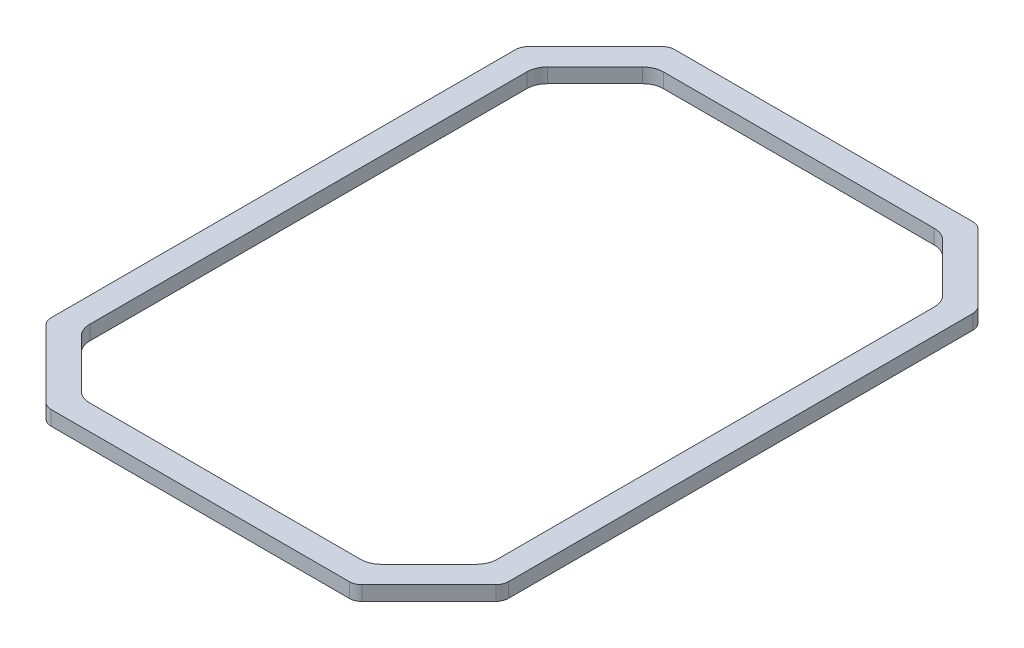
ISO-10303-21;
HEADER;
FILE_DESCRIPTION(('STEP AP214'),'2;1');
FILE_NAME('part.step','',(''),(''),'','','');
FILE_SCHEMA(('AUTOMOTIVE_DESIGN { 1 0 10303 214 1 1 1 1 }'));
ENDSEC;
DATA;
#1=APPLICATION_CONTEXT('core data for automotive mechanical design processes');
#2=APPLICATION_PROTOCOL_DEFINITION('international standard','automotive_design',2000,#1);
#3=PRODUCT_CONTEXT('',#1,'mechanical');
#4=PRODUCT('Part','Part','',(#3));
#5=PRODUCT_RELATED_PRODUCT_CATEGORY('part','',(#4));
#6=PRODUCT_DEFINITION_FORMATION('','',#4);
#7=PRODUCT_DEFINITION_CONTEXT('part definition',#1,'design');
#8=PRODUCT_DEFINITION('design','',#6,#7);
#9=PRODUCT_DEFINITION_SHAPE('','',#8);
#10=(LENGTH_UNIT() NAMED_UNIT(*) SI_UNIT(.MILLI.,.METRE.));
#11=(NAMED_UNIT(*) PLANE_ANGLE_UNIT() SI_UNIT($,.RADIAN.));
#12=(NAMED_UNIT(*) SI_UNIT($,.STERADIAN.) SOLID_ANGLE_UNIT());
#13=UNCERTAINTY_MEASURE_WITH_UNIT(LENGTH_MEASURE(1.E-05),#10,'distance_accuracy_value','');
#14=(GEOMETRIC_REPRESENTATION_CONTEXT(3) GLOBAL_UNCERTAINTY_ASSIGNED_CONTEXT((#13)) GLOBAL_UNIT_ASSIGNED_CONTEXT((#10,
#11,#12)) REPRESENTATION_CONTEXT('',''));
#15=CARTESIAN_POINT('',(0.,0.,0.));
#16=DIRECTION('',(0.,0.,1.));
#17=DIRECTION('',(1.,0.,0.));
#18=AXIS2_PLACEMENT_3D('',#15,#16,#17);
#19=CARTESIAN_POINT('',(-898.854903049563,1.75,-1750.13027438319));
#20=DIRECTION('',(0.,1.,0.));
#21=DIRECTION('',(0.,0.,1.));
#22=AXIS2_PLACEMENT_3D('',#19,#20,#21);
#23=PLANE('',#22);
#24=CARTESIAN_POINT('',(-898.854903049563,1.75,-1750.13027438319));
#25=DIRECTION('',(0.,1.,0.));
#26=DIRECTION('',(0.,0.,1.));
#27=AXIS2_PLACEMENT_3D('',#24,#25,#26);
#28=CIRCLE('',#27,1.4999999999999);
#29=CARTESIAN_POINT('',(-898.854903049563,1.75,-1751.63027438319));
#30=VERTEX_POINT('',#29);
#31=CARTESIAN_POINT('',(-899.915563221343,1.75,-1751.19093455497));
#32=VERTEX_POINT('',#31);
#33=EDGE_CURVE('E369',#30,#32,#28,.T.);
#34=ORIENTED_EDGE('',*,*,#33,.T.);
#35=DIRECTION('',(-0.707106781186543,0.,0.707106781186552));
#36=VECTOR('',#35,1.);
#37=CARTESIAN_POINT('',(-899.915563221343,1.75,-1751.19093455497));
#38=LINE('',#37,#36);
#39=CARTESIAN_POINT('',(-907.976580527229,1.75,-1743.12991724908));
#40=VERTEX_POINT('',#39);
#41=EDGE_CURVE('E372',#32,#40,#38,.T.);
#42=ORIENTED_EDGE('',*,*,#41,.T.);
#43=CARTESIAN_POINT('',(-906.915920355449,1.75,-1742.0692570773));
#44=DIRECTION('',(0.,1.,0.));
#45=DIRECTION('',(0.,0.,1.));
#46=AXIS2_PLACEMENT_3D('',#43,#44,#45);
#47=CIRCLE('',#46,1.50000000000002);
#48=CARTESIAN_POINT('',(-908.415920355449,1.75,-1742.0692570773));
#49=VERTEX_POINT('',#48);
#50=EDGE_CURVE('E375',#40,#49,#47,.T.);
#51=ORIENTED_EDGE('',*,*,#50,.T.);
#52=DIRECTION('',(0.,0.,1.));
#53=VECTOR('',#52,1.);
#54=CARTESIAN_POINT('',(-908.415920355449,1.75,-1742.0692570773));
#55=LINE('',#54,#53);
#56=CARTESIAN_POINT('',(-908.415920355449,1.75,-1686.19129168908));
#57=VERTEX_POINT('',#56);
#58=EDGE_CURVE('E377',#49,#57,#55,.T.);
#59=ORIENTED_EDGE('',*,*,#58,.T.);
#60=CARTESIAN_POINT('',(-906.915920355449,1.75,-1686.19129168908));
#61=DIRECTION('',(0.,1.,0.));
#62=DIRECTION('',(0.,0.,1.));
#63=AXIS2_PLACEMENT_3D('',#60,#61,#62);
#64=CIRCLE('',#63,1.50000000000002);
#65=CARTESIAN_POINT('',(-907.976580527229,1.75,-1685.1306315173));
#66=VERTEX_POINT('',#65);
#67=EDGE_CURVE('E379',#57,#66,#64,.T.);
#68=ORIENTED_EDGE('',*,*,#67,.T.);
#69=DIRECTION('',(0.707106781186552,0.,0.707106781186543));
#70=VECTOR('',#69,1.);
#71=CARTESIAN_POINT('',(-907.976580527229,1.75,-1685.1306315173));
#72=LINE('',#71,#70);
#73=CARTESIAN_POINT('',(-899.915563221343,1.75,-1677.06961421141));
#74=VERTEX_POINT('',#73);
#75=EDGE_CURVE('E381',#66,#74,#72,.T.);
#76=ORIENTED_EDGE('',*,*,#75,.T.);
#77=CARTESIAN_POINT('',(-898.854903049563,1.75,-1678.13027438319));
#78=DIRECTION('',(0.,1.,0.));
#79=DIRECTION('',(0.,0.,1.));
#80=AXIS2_PLACEMENT_3D('',#77,#78,#79);
#81=CIRCLE('',#80,1.50000000000002);
#82=CARTESIAN_POINT('',(-898.854903049563,1.75,-1676.63027438319));
#83=VERTEX_POINT('',#82);
#84=EDGE_CURVE('E383',#74,#83,#81,.T.);
#85=ORIENTED_EDGE('',*,*,#84,.T.);
#86=DIRECTION('',(1.,0.,0.));
#87=VECTOR('',#86,1.);
#88=CARTESIAN_POINT('',(-898.854903049563,1.75,-1676.63027438319));
#89=LINE('',#88,#87);
#90=CARTESIAN_POINT('',(-862.976937661335,1.75,-1676.63027438319));
#91=VERTEX_POINT('',#90);
#92=EDGE_CURVE('E385',#83,#91,#89,.T.);
#93=ORIENTED_EDGE('',*,*,#92,.T.);
#94=CARTESIAN_POINT('',(-862.976937661335,1.75,-1678.13027438319));
#95=DIRECTION('',(0.,1.,0.));
#96=DIRECTION('',(0.,0.,1.));
#97=AXIS2_PLACEMENT_3D('',#94,#95,#96);
#98=CIRCLE('',#97,1.49999999999998);
#99=CARTESIAN_POINT('',(-861.916277489555,1.75,-1677.06961421141));
#100=VERTEX_POINT('',#99);
#101=EDGE_CURVE('E387',#91,#100,#98,.T.);
#102=ORIENTED_EDGE('',*,*,#101,.T.);
#103=DIRECTION('',(0.707106781186552,0.,-0.707106781186543));
#104=VECTOR('',#103,1.);
#105=CARTESIAN_POINT('',(-861.916277489555,1.75,-1677.06961421141));
#106=LINE('',#105,#104);
#107=CARTESIAN_POINT('',(-853.855260183669,1.75,-1685.1306315173));
#108=VERTEX_POINT('',#107);
#109=EDGE_CURVE('E389',#100,#108,#106,.T.);
#110=ORIENTED_EDGE('',*,*,#109,.T.);
#111=CARTESIAN_POINT('',(-854.915920355449,1.75,-1686.19129168908));
#112=DIRECTION('',(0.,1.,0.));
#113=DIRECTION('',(0.,0.,1.));
#114=AXIS2_PLACEMENT_3D('',#111,#112,#113);
#115=CIRCLE('',#114,1.50000000000009);
#116=CARTESIAN_POINT('',(-853.415920355449,1.75,-1686.19129168908));
#117=VERTEX_POINT('',#116);
#118=EDGE_CURVE('E391',#108,#117,#115,.T.);
#119=ORIENTED_EDGE('',*,*,#118,.T.);
#120=DIRECTION('',(0.,0.,-1.));
#121=VECTOR('',#120,1.);
#122=CARTESIAN_POINT('',(-853.415920355449,1.75,-1686.19129168908));
#123=LINE('',#122,#121);
#124=CARTESIAN_POINT('',(-853.415920355449,1.75,-1742.0692570773));
#125=VERTEX_POINT('',#124);
#126=EDGE_CURVE('E393',#117,#125,#123,.T.);
#127=ORIENTED_EDGE('',*,*,#126,.T.);
#128=CARTESIAN_POINT('',(-854.915920355449,1.75,-1742.0692570773));
#129=DIRECTION('',(0.,1.,0.));
#130=DIRECTION('',(0.,0.,1.));
#131=AXIS2_PLACEMENT_3D('',#128,#129,#130);
#132=CIRCLE('',#131,1.49999999999992);
#133=CARTESIAN_POINT('',(-853.855260183669,1.75,-1743.12991724908));
#134=VERTEX_POINT('',#133);
#135=EDGE_CURVE('E395',#125,#134,#132,.T.);
#136=ORIENTED_EDGE('',*,*,#135,.T.);
#137=DIRECTION('',(-0.707106781186543,0.,-0.707106781186552));
#138=VECTOR('',#137,1.);
#139=CARTESIAN_POINT('',(-853.855260183669,1.75,-1743.12991724908));
#140=LINE('',#139,#138);
#141=CARTESIAN_POINT('',(-861.916277489555,1.75,-1751.19093455497));
#142=VERTEX_POINT('',#141);
#143=EDGE_CURVE('E397',#134,#142,#140,.T.);
#144=ORIENTED_EDGE('',*,*,#143,.T.);
#145=CARTESIAN_POINT('',(-862.976937661335,1.75,-1750.13027438319));
#146=DIRECTION('',(0.,1.,0.));
#147=DIRECTION('',(0.,0.,1.));
#148=AXIS2_PLACEMENT_3D('',#145,#146,#147);
#149=CIRCLE('',#148,1.49999999999987);
#150=CARTESIAN_POINT('',(-862.976937661335,1.75,-1751.63027438319));
#151=VERTEX_POINT('',#150);
#152=EDGE_CURVE('E399',#142,#151,#149,.T.);
#153=ORIENTED_EDGE('',*,*,#152,.T.);
#154=DIRECTION('',(-1.,0.,0.));
#155=VECTOR('',#154,1.);
#156=CARTESIAN_POINT('',(-862.976937661335,1.75,-1751.63027438319));
#157=LINE('',#156,#155);
#158=EDGE_CURVE('E401',#151,#30,#157,.T.);
#159=ORIENTED_EDGE('',*,*,#158,.T.);
#160=EDGE_LOOP('',(#34,#42,#51,#59,#68,#76,#85,#93,#102,#110,#119,#127,#136,#144,#153,#159));
#161=FACE_BOUND('',#160,.T.);
#162=DIRECTION('',(-0.707106781186548,0.,0.707106781186548));
#163=VECTOR('',#162,1.);
#164=CARTESIAN_POINT('',(-898.965815753037,1.75,-1747.89804133616));
#165=LINE('',#164,#163);
#166=CARTESIAN_POINT('',(-898.965815753037,1.75,-1747.89804133616));
#167=VERTEX_POINT('',#166);
#168=CARTESIAN_POINT('',(-904.683687308415,1.75,-1742.18016978078));
#169=VERTEX_POINT('',#168);
#170=EDGE_CURVE('E256',#167,#169,#165,.T.);
#171=ORIENTED_EDGE('',*,*,#170,.F.);
#172=CARTESIAN_POINT('',(-897.198048800071,1.75,-1746.13027438319));
#173=DIRECTION('',(0.,1.,0.));
#174=DIRECTION('',(0.,0.,1.));
#175=AXIS2_PLACEMENT_3D('',#172,#173,#174);
#176=CIRCLE('',#175,2.49999999999994);
#177=CARTESIAN_POINT('',(-897.198048800071,1.75,-1748.63027438319));
#178=VERTEX_POINT('',#177);
#179=EDGE_CURVE('E248',#178,#167,#176,.T.);
#180=ORIENTED_EDGE('',*,*,#179,.F.);
#181=DIRECTION('',(-1.,0.,0.));
#182=VECTOR('',#181,1.);
#183=CARTESIAN_POINT('',(-864.633791910827,1.75,-1748.63027438319));
#184=LINE('',#183,#182);
#185=CARTESIAN_POINT('',(-864.633791910827,1.75,-1748.63027438319));
#186=VERTEX_POINT('',#185);
#187=EDGE_CURVE('E297',#186,#178,#184,.T.);
#188=ORIENTED_EDGE('',*,*,#187,.F.);
#189=CARTESIAN_POINT('',(-864.633791910827,1.75,-1746.13027438319));
#190=DIRECTION('',(0.,1.,0.));
#191=DIRECTION('',(0.,0.,1.));
#192=AXIS2_PLACEMENT_3D('',#189,#190,#191);
#193=CIRCLE('',#192,2.49999999999998);
#194=CARTESIAN_POINT('',(-862.866024957861,1.75,-1747.89804133616));
#195=VERTEX_POINT('',#194);
#196=EDGE_CURVE('E295',#195,#186,#193,.T.);
#197=ORIENTED_EDGE('',*,*,#196,.F.);
#198=DIRECTION('',(-0.707106781186541,0.,-0.707106781186554));
#199=VECTOR('',#198,1.);
#200=CARTESIAN_POINT('',(-857.148153402483,1.75,-1742.18016978078));
#201=LINE('',#200,#199);
#202=CARTESIAN_POINT('',(-857.148153402483,1.75,-1742.18016978078));
#203=VERTEX_POINT('',#202);
#204=EDGE_CURVE('E293',#203,#195,#201,.T.);
#205=ORIENTED_EDGE('',*,*,#204,.F.);
#206=CARTESIAN_POINT('',(-858.915920355449,1.75,-1740.41240282781));
#207=DIRECTION('',(0.,1.,0.));
#208=DIRECTION('',(0.,0.,1.));
#209=AXIS2_PLACEMENT_3D('',#206,#207,#208);
#210=CIRCLE('',#209,2.49999999999994);
#211=CARTESIAN_POINT('',(-856.415920355449,1.75,-1740.41240282781));
#212=VERTEX_POINT('',#211);
#213=EDGE_CURVE('E291',#212,#203,#210,.T.);
#214=ORIENTED_EDGE('',*,*,#213,.F.);
#215=DIRECTION('',(0.,0.,-1.));
#216=VECTOR('',#215,1.);
#217=CARTESIAN_POINT('',(-856.415920355449,1.75,-1687.84814593857));
#218=LINE('',#217,#216);
#219=CARTESIAN_POINT('',(-856.415920355449,1.75,-1687.84814593857));
#220=VERTEX_POINT('',#219);
#221=EDGE_CURVE('E289',#220,#212,#218,.T.);
#222=ORIENTED_EDGE('',*,*,#221,.F.);
#223=CARTESIAN_POINT('',(-858.915920355449,1.75,-1687.84814593857));
#224=DIRECTION('',(0.,1.,0.));
#225=DIRECTION('',(0.,0.,1.));
#226=AXIS2_PLACEMENT_3D('',#223,#224,#225);
#227=CIRCLE('',#226,2.50000000000011);
#228=CARTESIAN_POINT('',(-857.148153402483,1.75,-1686.0803789856));
#229=VERTEX_POINT('',#228);
#230=EDGE_CURVE('E287',#229,#220,#227,.T.);
#231=ORIENTED_EDGE('',*,*,#230,.F.);
#232=DIRECTION('',(0.707106781186554,0.,-0.707106781186541));
#233=VECTOR('',#232,1.);
#234=CARTESIAN_POINT('',(-862.866024957861,1.75,-1680.36250743022));
#235=LINE('',#234,#233);
#236=CARTESIAN_POINT('',(-862.866024957861,1.75,-1680.36250743022));
#237=VERTEX_POINT('',#236);
#238=EDGE_CURVE('E285',#237,#229,#235,.T.);
#239=ORIENTED_EDGE('',*,*,#238,.F.);
#240=CARTESIAN_POINT('',(-864.633791910827,1.75,-1682.13027438319));
#241=DIRECTION('',(0.,1.,0.));
#242=DIRECTION('',(0.,0.,1.));
#243=AXIS2_PLACEMENT_3D('',#240,#241,#242);
#244=CIRCLE('',#243,2.49999999999998);
#245=CARTESIAN_POINT('',(-864.633791910827,1.75,-1679.63027438319));
#246=VERTEX_POINT('',#245);
#247=EDGE_CURVE('E283',#246,#237,#244,.T.);
#248=ORIENTED_EDGE('',*,*,#247,.F.);
#249=DIRECTION('',(1.,0.,0.));
#250=VECTOR('',#249,1.);
#251=CARTESIAN_POINT('',(-897.198048800071,1.75,-1679.63027438319));
#252=LINE('',#251,#250);
#253=CARTESIAN_POINT('',(-897.198048800071,1.75,-1679.63027438319));
#254=VERTEX_POINT('',#253);
#255=EDGE_CURVE('E281',#254,#246,#252,.T.);
#256=ORIENTED_EDGE('',*,*,#255,.F.);
#257=CARTESIAN_POINT('',(-897.198048800071,1.75,-1682.13027438319));
#258=DIRECTION('',(0.,1.,0.));
#259=DIRECTION('',(0.,0.,1.));
#260=AXIS2_PLACEMENT_3D('',#257,#258,#259);
#261=CIRCLE('',#260,2.49999999999994);
#262=CARTESIAN_POINT('',(-898.965815753037,1.75,-1680.36250743022));
#263=VERTEX_POINT('',#262);
#264=EDGE_CURVE('E279',#263,#254,#261,.T.);
#265=ORIENTED_EDGE('',*,*,#264,.F.);
#266=DIRECTION('',(0.707106781186561,0.,0.707106781186534));
#267=VECTOR('',#266,1.);
#268=CARTESIAN_POINT('',(-904.683687308415,1.75,-1686.0803789856));
#269=LINE('',#268,#267);
#270=CARTESIAN_POINT('',(-904.683687308415,1.75,-1686.0803789856));
#271=VERTEX_POINT('',#270);
#272=EDGE_CURVE('E277',#271,#263,#269,.T.);
#273=ORIENTED_EDGE('',*,*,#272,.F.);
#274=CARTESIAN_POINT('',(-902.915920355449,1.75,-1687.84814593857));
#275=DIRECTION('',(0.,1.,0.));
#276=DIRECTION('',(0.,0.,1.));
#277=AXIS2_PLACEMENT_3D('',#274,#275,#276);
#278=CIRCLE('',#277,2.50000000000011);
#279=CARTESIAN_POINT('',(-905.415920355449,1.75,-1687.84814593857));
#280=VERTEX_POINT('',#279);
#281=EDGE_CURVE('E275',#280,#271,#278,.T.);
#282=ORIENTED_EDGE('',*,*,#281,.F.);
#283=DIRECTION('',(0.,0.,1.));
#284=VECTOR('',#283,1.);
#285=CARTESIAN_POINT('',(-905.415920355449,1.75,-1740.41240282781));
#286=LINE('',#285,#284);
#287=CARTESIAN_POINT('',(-905.415920355449,1.75,-1740.41240282781));
#288=VERTEX_POINT('',#287);
#289=EDGE_CURVE('E271',#288,#280,#286,.T.);
#290=ORIENTED_EDGE('',*,*,#289,.F.);
#291=CARTESIAN_POINT('',(-902.915920355449,1.75,-1740.41240282781));
#292=DIRECTION('',(0.,1.,0.));
#293=DIRECTION('',(0.,0.,1.));
#294=AXIS2_PLACEMENT_3D('',#291,#292,#293);
#295=CIRCLE('',#294,2.50000000000003);
#296=EDGE_CURVE('E269',#169,#288,#295,.T.);
#297=ORIENTED_EDGE('',*,*,#296,.F.);
#298=EDGE_LOOP('',(#171,#180,#188,#197,#205,#214,#222,#231,#239,#248,#256,#265,#273,#282,#290,#297));
#299=FACE_BOUND('',#298,.T.);
#300=ADVANCED_FACE('F39',(#161,#299),#23,.T.);
#301=CARTESIAN_POINT('',(-898.854903049563,0.,-1750.13027438319));
#302=DIRECTION('',(0.,1.,0.));
#303=DIRECTION('',(0.,0.,1.));
#304=AXIS2_PLACEMENT_3D('',#301,#302,#303);
#305=PLANE('',#304);
#306=CARTESIAN_POINT('',(-898.854903049563,0.,-1750.13027438319));
#307=DIRECTION('',(0.,1.,0.));
#308=DIRECTION('',(0.,0.,1.));
#309=AXIS2_PLACEMENT_3D('',#306,#307,#308);
#310=CIRCLE('',#309,1.4999999999999);
#311=CARTESIAN_POINT('',(-898.854903049563,0.,-1751.63027438319));
#312=VERTEX_POINT('',#311);
#313=CARTESIAN_POINT('',(-899.915563221343,0.,-1751.19093455497));
#314=VERTEX_POINT('',#313);
#315=EDGE_CURVE('E264',#312,#314,#310,.T.);
#316=ORIENTED_EDGE('',*,*,#315,.F.);
#317=DIRECTION('',(-1.,0.,0.));
#318=VECTOR('',#317,1.);
#319=CARTESIAN_POINT('',(-862.976937661335,0.,-1751.63027438319));
#320=LINE('',#319,#318);
#321=CARTESIAN_POINT('',(-862.976937661335,0.,-1751.63027438319));
#322=VERTEX_POINT('',#321);
#323=EDGE_CURVE('E373',#322,#312,#320,.T.);
#324=ORIENTED_EDGE('',*,*,#323,.F.);
#325=CARTESIAN_POINT('',(-862.976937661335,0.,-1750.13027438319));
#326=DIRECTION('',(0.,1.,0.));
#327=DIRECTION('',(0.,0.,1.));
#328=AXIS2_PLACEMENT_3D('',#325,#326,#327);
#329=CIRCLE('',#328,1.49999999999987);
#330=CARTESIAN_POINT('',(-861.916277489555,0.,-1751.19093455497));
#331=VERTEX_POINT('',#330);
#332=EDGE_CURVE('E432',#331,#322,#329,.T.);
#333=ORIENTED_EDGE('',*,*,#332,.F.);
#334=DIRECTION('',(-0.707106781186543,0.,-0.707106781186552));
#335=VECTOR('',#334,1.);
#336=CARTESIAN_POINT('',(-853.855260183669,0.,-1743.12991724908));
#337=LINE('',#336,#335);
#338=CARTESIAN_POINT('',(-853.855260183669,0.,-1743.12991724908));
#339=VERTEX_POINT('',#338);
#340=EDGE_CURVE('E430',#339,#331,#337,.T.);
#341=ORIENTED_EDGE('',*,*,#340,.F.);
#342=CARTESIAN_POINT('',(-854.915920355449,0.,-1742.0692570773));
#343=DIRECTION('',(0.,1.,0.));
#344=DIRECTION('',(0.,0.,1.));
#345=AXIS2_PLACEMENT_3D('',#342,#343,#344);
#346=CIRCLE('',#345,1.49999999999992);
#347=CARTESIAN_POINT('',(-853.415920355449,0.,-1742.0692570773));
#348=VERTEX_POINT('',#347);
#349=EDGE_CURVE('E428',#348,#339,#346,.T.);
#350=ORIENTED_EDGE('',*,*,#349,.F.);
#351=DIRECTION('',(0.,0.,-1.));
#352=VECTOR('',#351,1.);
#353=CARTESIAN_POINT('',(-853.415920355449,0.,-1686.19129168908));
#354=LINE('',#353,#352);
#355=CARTESIAN_POINT('',(-853.415920355449,0.,-1686.19129168908));
#356=VERTEX_POINT('',#355);
#357=EDGE_CURVE('E426',#356,#348,#354,.T.);
#358=ORIENTED_EDGE('',*,*,#357,.F.);
#359=CARTESIAN_POINT('',(-854.915920355449,0.,-1686.19129168908));
#360=DIRECTION('',(0.,1.,0.));
#361=DIRECTION('',(0.,0.,1.));
#362=AXIS2_PLACEMENT_3D('',#359,#360,#361);
#363=CIRCLE('',#362,1.50000000000009);
#364=CARTESIAN_POINT('',(-853.855260183669,0.,-1685.1306315173));
#365=VERTEX_POINT('',#364);
#366=EDGE_CURVE('E424',#365,#356,#363,.T.);
#367=ORIENTED_EDGE('',*,*,#366,.F.);
#368=DIRECTION('',(0.707106781186552,0.,-0.707106781186543));
#369=VECTOR('',#368,1.);
#370=CARTESIAN_POINT('',(-861.916277489555,0.,-1677.06961421141));
#371=LINE('',#370,#369);
#372=CARTESIAN_POINT('',(-861.916277489555,0.,-1677.06961421141));
#373=VERTEX_POINT('',#372);
#374=EDGE_CURVE('E422',#373,#365,#371,.T.);
#375=ORIENTED_EDGE('',*,*,#374,.F.);
#376=CARTESIAN_POINT('',(-862.976937661335,0.,-1678.13027438319));
#377=DIRECTION('',(0.,1.,0.));
#378=DIRECTION('',(0.,0.,1.));
#379=AXIS2_PLACEMENT_3D('',#376,#377,#378);
#380=CIRCLE('',#379,1.49999999999998);
#381=CARTESIAN_POINT('',(-862.976937661335,0.,-1676.63027438319));
#382=VERTEX_POINT('',#381);
#383=EDGE_CURVE('E420',#382,#373,#380,.T.);
#384=ORIENTED_EDGE('',*,*,#383,.F.);
#385=DIRECTION('',(1.,0.,0.));
#386=VECTOR('',#385,1.);
#387=CARTESIAN_POINT('',(-898.854903049563,0.,-1676.63027438319));
#388=LINE('',#387,#386);
#389=CARTESIAN_POINT('',(-898.854903049563,0.,-1676.63027438319));
#390=VERTEX_POINT('',#389);
#391=EDGE_CURVE('E418',#390,#382,#388,.T.);
#392=ORIENTED_EDGE('',*,*,#391,.F.);
#393=CARTESIAN_POINT('',(-898.854903049563,0.,-1678.13027438319));
#394=DIRECTION('',(0.,1.,0.));
#395=DIRECTION('',(0.,0.,1.));
#396=AXIS2_PLACEMENT_3D('',#393,#394,#395);
#397=CIRCLE('',#396,1.50000000000002);
#398=CARTESIAN_POINT('',(-899.915563221343,0.,-1677.06961421141));
#399=VERTEX_POINT('',#398);
#400=EDGE_CURVE('E416',#399,#390,#397,.T.);
#401=ORIENTED_EDGE('',*,*,#400,.F.);
#402=DIRECTION('',(0.707106781186552,0.,0.707106781186543));
#403=VECTOR('',#402,1.);
#404=CARTESIAN_POINT('',(-907.976580527229,0.,-1685.1306315173));
#405=LINE('',#404,#403);
#406=CARTESIAN_POINT('',(-907.976580527229,0.,-1685.1306315173));
#407=VERTEX_POINT('',#406);
#408=EDGE_CURVE('E414',#407,#399,#405,.T.);
#409=ORIENTED_EDGE('',*,*,#408,.F.);
#410=CARTESIAN_POINT('',(-906.915920355449,0.,-1686.19129168908));
#411=DIRECTION('',(0.,1.,0.));
#412=DIRECTION('',(0.,0.,1.));
#413=AXIS2_PLACEMENT_3D('',#410,#411,#412);
#414=CIRCLE('',#413,1.50000000000002);
#415=CARTESIAN_POINT('',(-908.415920355449,0.,-1686.19129168908));
#416=VERTEX_POINT('',#415);
#417=EDGE_CURVE('E412',#416,#407,#414,.T.);
#418=ORIENTED_EDGE('',*,*,#417,.F.);
#419=DIRECTION('',(0.,0.,1.));
#420=VECTOR('',#419,1.);
#421=CARTESIAN_POINT('',(-908.415920355449,0.,-1742.0692570773));
#422=LINE('',#421,#420);
#423=CARTESIAN_POINT('',(-908.415920355449,0.,-1742.0692570773));
#424=VERTEX_POINT('',#423);
#425=EDGE_CURVE('E410',#424,#416,#422,.T.);
#426=ORIENTED_EDGE('',*,*,#425,.F.);
#427=CARTESIAN_POINT('',(-906.915920355449,0.,-1742.0692570773));
#428=DIRECTION('',(0.,1.,0.));
#429=DIRECTION('',(0.,0.,1.));
#430=AXIS2_PLACEMENT_3D('',#427,#428,#429);
#431=CIRCLE('',#430,1.50000000000002);
#432=CARTESIAN_POINT('',(-907.976580527229,0.,-1743.12991724908));
#433=VERTEX_POINT('',#432);
#434=EDGE_CURVE('E408',#433,#424,#431,.T.);
#435=ORIENTED_EDGE('',*,*,#434,.F.);
#436=DIRECTION('',(-0.707106781186543,0.,0.707106781186552));
#437=VECTOR('',#436,1.);
#438=CARTESIAN_POINT('',(-899.915563221343,0.,-1751.19093455497));
#439=LINE('',#438,#437);
#440=EDGE_CURVE('E406',#314,#433,#439,.T.);
#441=ORIENTED_EDGE('',*,*,#440,.F.);
#442=EDGE_LOOP('',(#316,#324,#333,#341,#350,#358,#367,#375,#384,#392,#401,#409,#418,#426,#435,#441));
#443=FACE_BOUND('',#442,.T.);
#444=CARTESIAN_POINT('',(-897.198048800071,0.,-1746.13027438319));
#445=DIRECTION('',(0.,1.,0.));
#446=DIRECTION('',(0.,0.,1.));
#447=AXIS2_PLACEMENT_3D('',#444,#445,#446);
#448=CIRCLE('',#447,2.49999999999994);
#449=CARTESIAN_POINT('',(-897.198048800071,0.,-1748.63027438319));
#450=VERTEX_POINT('',#449);
#451=CARTESIAN_POINT('',(-898.965815753037,0.,-1747.89804133616));
#452=VERTEX_POINT('',#451);
#453=EDGE_CURVE('E62',#450,#452,#448,.T.);
#454=ORIENTED_EDGE('',*,*,#453,.T.);
#455=DIRECTION('',(-0.707106781186548,0.,0.707106781186548));
#456=VECTOR('',#455,1.);
#457=CARTESIAN_POINT('',(-898.965815753037,0.,-1747.89804133616));
#458=LINE('',#457,#456);
#459=CARTESIAN_POINT('',(-904.683687308415,0.,-1742.18016978078));
#460=VERTEX_POINT('',#459);
#461=EDGE_CURVE('E263',#452,#460,#458,.T.);
#462=ORIENTED_EDGE('',*,*,#461,.T.);
#463=CARTESIAN_POINT('',(-902.915920355449,0.,-1740.41240282781));
#464=DIRECTION('',(0.,1.,0.));
#465=DIRECTION('',(0.,0.,1.));
#466=AXIS2_PLACEMENT_3D('',#463,#464,#465);
#467=CIRCLE('',#466,2.50000000000003);
#468=CARTESIAN_POINT('',(-905.415920355449,0.,-1740.41240282781));
#469=VERTEX_POINT('',#468);
#470=EDGE_CURVE('E301',#460,#469,#467,.T.);
#471=ORIENTED_EDGE('',*,*,#470,.T.);
#472=DIRECTION('',(0.,0.,1.));
#473=VECTOR('',#472,1.);
#474=CARTESIAN_POINT('',(-905.415920355449,0.,-1740.41240282781));
#475=LINE('',#474,#473);
#476=CARTESIAN_POINT('',(-905.415920355449,0.,-1687.84814593857));
#477=VERTEX_POINT('',#476);
#478=EDGE_CURVE('E304',#469,#477,#475,.T.);
#479=ORIENTED_EDGE('',*,*,#478,.T.);
#480=CARTESIAN_POINT('',(-902.915920355449,0.,-1687.84814593857));
#481=DIRECTION('',(0.,1.,0.));
#482=DIRECTION('',(0.,0.,1.));
#483=AXIS2_PLACEMENT_3D('',#480,#481,#482);
#484=CIRCLE('',#483,2.50000000000011);
#485=CARTESIAN_POINT('',(-904.683687308415,0.,-1686.0803789856));
#486=VERTEX_POINT('',#485);
#487=EDGE_CURVE('E307',#477,#486,#484,.T.);
#488=ORIENTED_EDGE('',*,*,#487,.T.);
#489=DIRECTION('',(0.707106781186561,0.,0.707106781186534));
#490=VECTOR('',#489,1.);
#491=CARTESIAN_POINT('',(-904.683687308415,0.,-1686.0803789856));
#492=LINE('',#491,#490);
#493=CARTESIAN_POINT('',(-898.965815753037,0.,-1680.36250743022));
#494=VERTEX_POINT('',#493);
#495=EDGE_CURVE('E310',#486,#494,#492,.T.);
#496=ORIENTED_EDGE('',*,*,#495,.T.);
#497=CARTESIAN_POINT('',(-897.198048800071,0.,-1682.13027438319));
#498=DIRECTION('',(0.,1.,0.));
#499=DIRECTION('',(0.,0.,1.));
#500=AXIS2_PLACEMENT_3D('',#497,#498,#499);
#501=CIRCLE('',#500,2.49999999999994);
#502=CARTESIAN_POINT('',(-897.198048800071,0.,-1679.63027438319));
#503=VERTEX_POINT('',#502);
#504=EDGE_CURVE('E313',#494,#503,#501,.T.);
#505=ORIENTED_EDGE('',*,*,#504,.T.);
#506=DIRECTION('',(1.,0.,0.));
#507=VECTOR('',#506,1.);
#508=CARTESIAN_POINT('',(-897.198048800071,0.,-1679.63027438319));
#509=LINE('',#508,#507);
#510=CARTESIAN_POINT('',(-864.633791910827,0.,-1679.63027438319));
#511=VERTEX_POINT('',#510);
#512=EDGE_CURVE('E316',#503,#511,#509,.T.);
#513=ORIENTED_EDGE('',*,*,#512,.T.);
#514=CARTESIAN_POINT('',(-864.633791910827,0.,-1682.13027438319));
#515=DIRECTION('',(0.,1.,0.));
#516=DIRECTION('',(0.,0.,1.));
#517=AXIS2_PLACEMENT_3D('',#514,#515,#516);
#518=CIRCLE('',#517,2.49999999999998);
#519=CARTESIAN_POINT('',(-862.866024957861,0.,-1680.36250743022));
#520=VERTEX_POINT('',#519);
#521=EDGE_CURVE('E319',#511,#520,#518,.T.);
#522=ORIENTED_EDGE('',*,*,#521,.T.);
#523=DIRECTION('',(0.707106781186554,0.,-0.707106781186541));
#524=VECTOR('',#523,1.);
#525=CARTESIAN_POINT('',(-862.866024957861,0.,-1680.36250743022));
#526=LINE('',#525,#524);
#527=CARTESIAN_POINT('',(-857.148153402483,0.,-1686.0803789856));
#528=VERTEX_POINT('',#527);
#529=EDGE_CURVE('E322',#520,#528,#526,.T.);
#530=ORIENTED_EDGE('',*,*,#529,.T.);
#531=CARTESIAN_POINT('',(-858.915920355449,0.,-1687.84814593857));
#532=DIRECTION('',(0.,1.,0.));
#533=DIRECTION('',(0.,0.,1.));
#534=AXIS2_PLACEMENT_3D('',#531,#532,#533);
#535=CIRCLE('',#534,2.50000000000011);
#536=CARTESIAN_POINT('',(-856.415920355449,0.,-1687.84814593857));
#537=VERTEX_POINT('',#536);
#538=EDGE_CURVE('E325',#528,#537,#535,.T.);
#539=ORIENTED_EDGE('',*,*,#538,.T.);
#540=DIRECTION('',(0.,0.,-1.));
#541=VECTOR('',#540,1.);
#542=CARTESIAN_POINT('',(-856.415920355449,0.,-1687.84814593857));
#543=LINE('',#542,#541);
#544=CARTESIAN_POINT('',(-856.415920355449,0.,-1740.41240282781));
#545=VERTEX_POINT('',#544);
#546=EDGE_CURVE('E328',#537,#545,#543,.T.);
#547=ORIENTED_EDGE('',*,*,#546,.T.);
#548=CARTESIAN_POINT('',(-858.915920355449,0.,-1740.41240282781));
#549=DIRECTION('',(0.,1.,0.));
#550=DIRECTION('',(0.,0.,1.));
#551=AXIS2_PLACEMENT_3D('',#548,#549,#550);
#552=CIRCLE('',#551,2.49999999999994);
#553=CARTESIAN_POINT('',(-857.148153402483,0.,-1742.18016978078));
#554=VERTEX_POINT('',#553);
#555=EDGE_CURVE('E331',#545,#554,#552,.T.);
#556=ORIENTED_EDGE('',*,*,#555,.T.);
#557=DIRECTION('',(-0.707106781186541,0.,-0.707106781186554));
#558=VECTOR('',#557,1.);
#559=CARTESIAN_POINT('',(-857.148153402483,0.,-1742.18016978078));
#560=LINE('',#559,#558);
#561=CARTESIAN_POINT('',(-862.866024957861,0.,-1747.89804133616));
#562=VERTEX_POINT('',#561);
#563=EDGE_CURVE('E334',#554,#562,#560,.T.);
#564=ORIENTED_EDGE('',*,*,#563,.T.);
#565=CARTESIAN_POINT('',(-864.633791910827,0.,-1746.13027438319));
#566=DIRECTION('',(0.,1.,0.));
#567=DIRECTION('',(0.,0.,1.));
#568=AXIS2_PLACEMENT_3D('',#565,#566,#567);
#569=CIRCLE('',#568,2.49999999999998);
#570=CARTESIAN_POINT('',(-864.633791910827,0.,-1748.63027438319));
#571=VERTEX_POINT('',#570);
#572=EDGE_CURVE('E337',#562,#571,#569,.T.);
#573=ORIENTED_EDGE('',*,*,#572,.T.);
#574=DIRECTION('',(-1.,0.,0.));
#575=VECTOR('',#574,1.);
#576=CARTESIAN_POINT('',(-864.633791910827,0.,-1748.63027438319));
#577=LINE('',#576,#575);
#578=EDGE_CURVE('E257',#571,#450,#577,.T.);
#579=ORIENTED_EDGE('',*,*,#578,.T.);
#580=EDGE_LOOP('',(#454,#462,#471,#479,#488,#496,#505,#513,#522,#530,#539,#547,#556,#564,#573,#579));
#581=FACE_BOUND('',#580,.T.);
#582=ADVANCED_FACE('F486',(#443,#581),#305,.F.);
#583=CARTESIAN_POINT('',(-898.854903049563,1.75,-1750.13027438319));
#584=DIRECTION('',(0.,-1.,0.));
#585=DIRECTION('',(0.,0.,-1.));
#586=AXIS2_PLACEMENT_3D('',#583,#584,#585);
#587=CYLINDRICAL_SURFACE('',#586,1.4999999999999);
#588=ORIENTED_EDGE('',*,*,#315,.T.);
#589=DIRECTION('',(0.,-1.,0.));
#590=VECTOR('',#589,1.);
#591=CARTESIAN_POINT('',(-899.915563221343,1.75,-1751.19093455497));
#592=LINE('',#591,#590);
#593=EDGE_CURVE('E11',#32,#314,#592,.T.);
#594=ORIENTED_EDGE('',*,*,#593,.F.);
#595=ORIENTED_EDGE('',*,*,#33,.F.);
#596=DIRECTION('',(0.,-1.,0.));
#597=VECTOR('',#596,1.);
#598=CARTESIAN_POINT('',(-898.854903049563,1.75,-1751.63027438319));
#599=LINE('',#598,#597);
#600=EDGE_CURVE('E403',#30,#312,#599,.T.);
#601=ORIENTED_EDGE('',*,*,#600,.T.);
#602=EDGE_LOOP('',(#588,#594,#595,#601));
#603=FACE_BOUND('',#602,.T.);
#604=ADVANCED_FACE('F41',(#603),#587,.T.);
#605=CARTESIAN_POINT('',(-899.915563221343,1.75,-1751.19093455497));
#606=DIRECTION('',(0.707106781186552,0.,0.707106781186543));
#607=DIRECTION('',(0.707106781186543,0.,-0.707106781186552));
#608=AXIS2_PLACEMENT_3D('',#605,#606,#607);
#609=PLANE('',#608);
#610=ORIENTED_EDGE('',*,*,#440,.T.);
#611=DIRECTION('',(0.,-1.,0.));
#612=VECTOR('',#611,1.);
#613=CARTESIAN_POINT('',(-907.976580527229,1.75,-1743.12991724908));
#614=LINE('',#613,#612);
#615=EDGE_CURVE('E47',#40,#433,#614,.T.);
#616=ORIENTED_EDGE('',*,*,#615,.F.);
#617=ORIENTED_EDGE('',*,*,#41,.F.);
#618=ORIENTED_EDGE('',*,*,#593,.T.);
#619=EDGE_LOOP('',(#610,#616,#617,#618));
#620=FACE_BOUND('',#619,.T.);
#621=ADVANCED_FACE('F503',(#620),#609,.F.);
#622=CARTESIAN_POINT('',(-906.915920355449,1.75,-1742.0692570773));
#623=DIRECTION('',(0.,-1.,0.));
#624=DIRECTION('',(0.,0.,-1.));
#625=AXIS2_PLACEMENT_3D('',#622,#623,#624);
#626=CYLINDRICAL_SURFACE('',#625,1.50000000000002);
#627=ORIENTED_EDGE('',*,*,#434,.T.);
#628=DIRECTION('',(0.,-1.,0.));
#629=VECTOR('',#628,1.);
#630=CARTESIAN_POINT('',(-908.415920355449,1.75,-1742.0692570773));
#631=LINE('',#630,#629);
#632=EDGE_CURVE('E473',#49,#424,#631,.T.);
#633=ORIENTED_EDGE('',*,*,#632,.F.);
#634=ORIENTED_EDGE('',*,*,#50,.F.);
#635=ORIENTED_EDGE('',*,*,#615,.T.);
#636=EDGE_LOOP('',(#627,#633,#634,#635));
#637=FACE_BOUND('',#636,.T.);
#638=ADVANCED_FACE('F480',(#637),#626,.T.);
#639=CARTESIAN_POINT('',(-908.415920355449,1.75,-1742.0692570773));
#640=DIRECTION('',(1.,0.,0.));
#641=DIRECTION('',(0.,0.,-1.));
#642=AXIS2_PLACEMENT_3D('',#639,#640,#641);
#643=PLANE('',#642);
#644=ORIENTED_EDGE('',*,*,#425,.T.);
#645=DIRECTION('',(0.,-1.,0.));
#646=VECTOR('',#645,1.);
#647=CARTESIAN_POINT('',(-908.415920355449,1.75,-1686.19129168908));
#648=LINE('',#647,#646);
#649=EDGE_CURVE('E470',#57,#416,#648,.T.);
#650=ORIENTED_EDGE('',*,*,#649,.F.);
#651=ORIENTED_EDGE('',*,*,#58,.F.);
#652=ORIENTED_EDGE('',*,*,#632,.T.);
#653=EDGE_LOOP('',(#644,#650,#651,#652));
#654=FACE_BOUND('',#653,.T.);
#655=ADVANCED_FACE('F492',(#654),#643,.F.);
#656=CARTESIAN_POINT('',(-906.915920355449,1.75,-1686.19129168908));
#657=DIRECTION('',(0.,-1.,0.));
#658=DIRECTION('',(0.,0.,-1.));
#659=AXIS2_PLACEMENT_3D('',#656,#657,#658);
#660=CYLINDRICAL_SURFACE('',#659,1.50000000000002);
#661=ORIENTED_EDGE('',*,*,#417,.T.);
#662=DIRECTION('',(0.,-1.,0.));
#663=VECTOR('',#662,1.);
#664=CARTESIAN_POINT('',(-907.976580527229,1.75,-1685.1306315173));
#665=LINE('',#664,#663);
#666=EDGE_CURVE('E467',#66,#407,#665,.T.);
#667=ORIENTED_EDGE('',*,*,#666,.F.);
#668=ORIENTED_EDGE('',*,*,#67,.F.);
#669=ORIENTED_EDGE('',*,*,#649,.T.);
#670=EDGE_LOOP('',(#661,#667,#668,#669));
#671=FACE_BOUND('',#670,.T.);
#672=ADVANCED_FACE('F496',(#671),#660,.T.);
#673=CARTESIAN_POINT('',(-907.976580527229,1.75,-1685.1306315173));
#674=DIRECTION('',(0.707106781186543,0.,-0.707106781186552));
#675=DIRECTION('',(-0.707106781186552,0.,-0.707106781186543));
#676=AXIS2_PLACEMENT_3D('',#673,#674,#675);
#677=PLANE('',#676);
#678=ORIENTED_EDGE('',*,*,#408,.T.);
#679=DIRECTION('',(0.,-1.,0.));
#680=VECTOR('',#679,1.);
#681=CARTESIAN_POINT('',(-899.915563221343,1.75,-1677.06961421141));
#682=LINE('',#681,#680);
#683=EDGE_CURVE('E464',#74,#399,#682,.T.);
#684=ORIENTED_EDGE('',*,*,#683,.F.);
#685=ORIENTED_EDGE('',*,*,#75,.F.);
#686=ORIENTED_EDGE('',*,*,#666,.T.);
#687=EDGE_LOOP('',(#678,#684,#685,#686));
#688=FACE_BOUND('',#687,.T.);
#689=ADVANCED_FACE('F556',(#688),#677,.F.);
#690=CARTESIAN_POINT('',(-898.854903049563,1.75,-1678.13027438319));
#691=DIRECTION('',(0.,-1.,0.));
#692=DIRECTION('',(0.,0.,-1.));
#693=AXIS2_PLACEMENT_3D('',#690,#691,#692);
#694=CYLINDRICAL_SURFACE('',#693,1.50000000000002);
#695=ORIENTED_EDGE('',*,*,#400,.T.);
#696=DIRECTION('',(0.,-1.,0.));
#697=VECTOR('',#696,1.);
#698=CARTESIAN_POINT('',(-898.854903049563,1.75,-1676.63027438319));
#699=LINE('',#698,#697);
#700=EDGE_CURVE('E461',#83,#390,#699,.T.);
#701=ORIENTED_EDGE('',*,*,#700,.F.);
#702=ORIENTED_EDGE('',*,*,#84,.F.);
#703=ORIENTED_EDGE('',*,*,#683,.T.);
#704=EDGE_LOOP('',(#695,#701,#702,#703));
#705=FACE_BOUND('',#704,.T.);
#706=ADVANCED_FACE('F553',(#705),#694,.T.);
#707=CARTESIAN_POINT('',(-898.854903049563,1.75,-1676.63027438319));
#708=DIRECTION('',(0.,0.,-1.));
#709=DIRECTION('',(-1.,0.,0.));
#710=AXIS2_PLACEMENT_3D('',#707,#708,#709);
#711=PLANE('',#710);
#712=ORIENTED_EDGE('',*,*,#391,.T.);
#713=DIRECTION('',(0.,-1.,0.));
#714=VECTOR('',#713,1.);
#715=CARTESIAN_POINT('',(-862.976937661335,1.75,-1676.63027438319));
#716=LINE('',#715,#714);
#717=EDGE_CURVE('E458',#91,#382,#716,.T.);
#718=ORIENTED_EDGE('',*,*,#717,.F.);
#719=ORIENTED_EDGE('',*,*,#92,.F.);
#720=ORIENTED_EDGE('',*,*,#700,.T.);
#721=EDGE_LOOP('',(#712,#718,#719,#720));
#722=FACE_BOUND('',#721,.T.);
#723=ADVANCED_FACE('F549',(#722),#711,.F.);
#724=CARTESIAN_POINT('',(-862.976937661335,1.75,-1678.13027438319));
#725=DIRECTION('',(0.,-1.,0.));
#726=DIRECTION('',(0.,0.,-1.));
#727=AXIS2_PLACEMENT_3D('',#724,#725,#726);
#728=CYLINDRICAL_SURFACE('',#727,1.49999999999998);
#729=ORIENTED_EDGE('',*,*,#383,.T.);
#730=DIRECTION('',(0.,-1.,0.));
#731=VECTOR('',#730,1.);
#732=CARTESIAN_POINT('',(-861.916277489555,1.75,-1677.06961421141));
#733=LINE('',#732,#731);
#734=EDGE_CURVE('E455',#100,#373,#733,.T.);
#735=ORIENTED_EDGE('',*,*,#734,.F.);
#736=ORIENTED_EDGE('',*,*,#101,.F.);
#737=ORIENTED_EDGE('',*,*,#717,.T.);
#738=EDGE_LOOP('',(#729,#735,#736,#737));
#739=FACE_BOUND('',#738,.T.);
#740=ADVANCED_FACE('F545',(#739),#728,.T.);
#741=CARTESIAN_POINT('',(-861.916277489555,1.75,-1677.06961421141));
#742=DIRECTION('',(-0.707106781186543,0.,-0.707106781186552));
#743=DIRECTION('',(-0.707106781186552,0.,0.707106781186543));
#744=AXIS2_PLACEMENT_3D('',#741,#742,#743);
#745=PLANE('',#744);
#746=ORIENTED_EDGE('',*,*,#374,.T.);
#747=DIRECTION('',(0.,-1.,0.));
#748=VECTOR('',#747,1.);
#749=CARTESIAN_POINT('',(-853.855260183669,1.75,-1685.1306315173));
#750=LINE('',#749,#748);
#751=EDGE_CURVE('E452',#108,#365,#750,.T.);
#752=ORIENTED_EDGE('',*,*,#751,.F.);
#753=ORIENTED_EDGE('',*,*,#109,.F.);
#754=ORIENTED_EDGE('',*,*,#734,.T.);
#755=EDGE_LOOP('',(#746,#752,#753,#754));
#756=FACE_BOUND('',#755,.T.);
#757=ADVANCED_FACE('F540',(#756),#745,.F.);
#758=CARTESIAN_POINT('',(-854.915920355449,1.75,-1686.19129168908));
#759=DIRECTION('',(0.,-1.,0.));
#760=DIRECTION('',(0.,0.,-1.));
#761=AXIS2_PLACEMENT_3D('',#758,#759,#760);
#762=CYLINDRICAL_SURFACE('',#761,1.50000000000009);
#763=ORIENTED_EDGE('',*,*,#366,.T.);
#764=DIRECTION('',(0.,-1.,0.));
#765=VECTOR('',#764,1.);
#766=CARTESIAN_POINT('',(-853.415920355449,1.75,-1686.19129168908));
#767=LINE('',#766,#765);
#768=EDGE_CURVE('E449',#117,#356,#767,.T.);
#769=ORIENTED_EDGE('',*,*,#768,.F.);
#770=ORIENTED_EDGE('',*,*,#118,.F.);
#771=ORIENTED_EDGE('',*,*,#751,.T.);
#772=EDGE_LOOP('',(#763,#769,#770,#771));
#773=FACE_BOUND('',#772,.T.);
#774=ADVANCED_FACE('F534',(#773),#762,.T.);
#775=CARTESIAN_POINT('',(-853.415920355449,1.75,-1686.19129168908));
#776=DIRECTION('',(-1.,0.,0.));
#777=DIRECTION('',(0.,0.,1.));
#778=AXIS2_PLACEMENT_3D('',#775,#776,#777);
#779=PLANE('',#778);
#780=ORIENTED_EDGE('',*,*,#357,.T.);
#781=DIRECTION('',(0.,-1.,0.));
#782=VECTOR('',#781,1.);
#783=CARTESIAN_POINT('',(-853.415920355449,1.75,-1742.0692570773));
#784=LINE('',#783,#782);
#785=EDGE_CURVE('E446',#125,#348,#784,.T.);
#786=ORIENTED_EDGE('',*,*,#785,.F.);
#787=ORIENTED_EDGE('',*,*,#126,.F.);
#788=ORIENTED_EDGE('',*,*,#768,.T.);
#789=EDGE_LOOP('',(#780,#786,#787,#788));
#790=FACE_BOUND('',#789,.T.);
#791=ADVANCED_FACE('F530',(#790),#779,.F.);
#792=CARTESIAN_POINT('',(-854.915920355449,1.75,-1742.0692570773));
#793=DIRECTION('',(0.,-1.,0.));
#794=DIRECTION('',(0.,0.,-1.));
#795=AXIS2_PLACEMENT_3D('',#792,#793,#794);
#796=CYLINDRICAL_SURFACE('',#795,1.49999999999992);
#797=ORIENTED_EDGE('',*,*,#349,.T.);
#798=DIRECTION('',(0.,-1.,0.));
#799=VECTOR('',#798,1.);
#800=CARTESIAN_POINT('',(-853.855260183669,1.75,-1743.12991724908));
#801=LINE('',#800,#799);
#802=EDGE_CURVE('E443',#134,#339,#801,.T.);
#803=ORIENTED_EDGE('',*,*,#802,.F.);
#804=ORIENTED_EDGE('',*,*,#135,.F.);
#805=ORIENTED_EDGE('',*,*,#785,.T.);
#806=EDGE_LOOP('',(#797,#803,#804,#805));
#807=FACE_BOUND('',#806,.T.);
#808=ADVANCED_FACE('F525',(#807),#796,.T.);
#809=CARTESIAN_POINT('',(-853.855260183669,1.75,-1743.12991724908));
#810=DIRECTION('',(-0.707106781186552,0.,0.707106781186543));
#811=DIRECTION('',(0.707106781186543,0.,0.707106781186552));
#812=AXIS2_PLACEMENT_3D('',#809,#810,#811);
#813=PLANE('',#812);
#814=ORIENTED_EDGE('',*,*,#340,.T.);
#815=DIRECTION('',(0.,-1.,0.));
#816=VECTOR('',#815,1.);
#817=CARTESIAN_POINT('',(-861.916277489555,1.75,-1751.19093455497));
#818=LINE('',#817,#816);
#819=EDGE_CURVE('E440',#142,#331,#818,.T.);
#820=ORIENTED_EDGE('',*,*,#819,.F.);
#821=ORIENTED_EDGE('',*,*,#143,.F.);
#822=ORIENTED_EDGE('',*,*,#802,.T.);
#823=EDGE_LOOP('',(#814,#820,#821,#822));
#824=FACE_BOUND('',#823,.T.);
#825=ADVANCED_FACE('F519',(#824),#813,.F.);
#826=CARTESIAN_POINT('',(-862.976937661335,1.75,-1750.13027438319));
#827=DIRECTION('',(0.,-1.,0.));
#828=DIRECTION('',(0.,0.,-1.));
#829=AXIS2_PLACEMENT_3D('',#826,#827,#828);
#830=CYLINDRICAL_SURFACE('',#829,1.49999999999987);
#831=ORIENTED_EDGE('',*,*,#332,.T.);
#832=DIRECTION('',(0.,-1.,0.));
#833=VECTOR('',#832,1.);
#834=CARTESIAN_POINT('',(-862.976937661335,1.75,-1751.63027438319));
#835=LINE('',#834,#833);
#836=EDGE_CURVE('E437',#151,#322,#835,.T.);
#837=ORIENTED_EDGE('',*,*,#836,.F.);
#838=ORIENTED_EDGE('',*,*,#152,.F.);
#839=ORIENTED_EDGE('',*,*,#819,.T.);
#840=EDGE_LOOP('',(#831,#837,#838,#839));
#841=FACE_BOUND('',#840,.T.);
#842=ADVANCED_FACE('F515',(#841),#830,.T.);
#843=CARTESIAN_POINT('',(-862.976937661335,1.75,-1751.63027438319));
#844=DIRECTION('',(0.,0.,1.));
#845=DIRECTION('',(1.,0.,0.));
#846=AXIS2_PLACEMENT_3D('',#843,#844,#845);
#847=PLANE('',#846);
#848=ORIENTED_EDGE('',*,*,#323,.T.);
#849=ORIENTED_EDGE('',*,*,#600,.F.);
#850=ORIENTED_EDGE('',*,*,#158,.F.);
#851=ORIENTED_EDGE('',*,*,#836,.T.);
#852=EDGE_LOOP('',(#848,#849,#850,#851));
#853=FACE_BOUND('',#852,.T.);
#854=ADVANCED_FACE('F510',(#853),#847,.F.);
#855=CARTESIAN_POINT('',(-897.198048800071,1.75,-1746.13027438319));
#856=DIRECTION('',(0.,-1.,0.));
#857=DIRECTION('',(0.,0.,-1.));
#858=AXIS2_PLACEMENT_3D('',#855,#856,#857);
#859=CYLINDRICAL_SURFACE('',#858,2.49999999999994);
#860=ORIENTED_EDGE('',*,*,#453,.F.);
#861=DIRECTION('',(0.,-1.,0.));
#862=VECTOR('',#861,1.);
#863=CARTESIAN_POINT('',(-897.198048800071,1.75,-1748.63027438319));
#864=LINE('',#863,#862);
#865=EDGE_CURVE('E252',#178,#450,#864,.T.);
#866=ORIENTED_EDGE('',*,*,#865,.F.);
#867=ORIENTED_EDGE('',*,*,#179,.T.);
#868=DIRECTION('',(0.,-1.,0.));
#869=VECTOR('',#868,1.);
#870=CARTESIAN_POINT('',(-898.965815753037,1.75,-1747.89804133616));
#871=LINE('',#870,#869);
#872=EDGE_CURVE('E251',#167,#452,#871,.T.);
#873=ORIENTED_EDGE('',*,*,#872,.T.);
#874=EDGE_LOOP('',(#860,#866,#867,#873));
#875=FACE_BOUND('',#874,.T.);
#876=ADVANCED_FACE('F250',(#875),#859,.F.);
#877=CARTESIAN_POINT('',(-898.965815753037,1.75,-1747.89804133616));
#878=DIRECTION('',(0.707106781186547,0.,0.707106781186547));
#879=DIRECTION('',(0.707106781186548,0.,-0.707106781186548));
#880=AXIS2_PLACEMENT_3D('',#877,#878,#879);
#881=PLANE('',#880);
#882=ORIENTED_EDGE('',*,*,#461,.F.);
#883=ORIENTED_EDGE('',*,*,#872,.F.);
#884=ORIENTED_EDGE('',*,*,#170,.T.);
#885=DIRECTION('',(0.,-1.,0.));
#886=VECTOR('',#885,1.);
#887=CARTESIAN_POINT('',(-904.683687308415,1.75,-1742.18016978078));
#888=LINE('',#887,#886);
#889=EDGE_CURVE('E265',#169,#460,#888,.T.);
#890=ORIENTED_EDGE('',*,*,#889,.T.);
#891=EDGE_LOOP('',(#882,#883,#884,#890));
#892=FACE_BOUND('',#891,.T.);
#893=ADVANCED_FACE('F260',(#892),#881,.T.);
#894=CARTESIAN_POINT('',(-902.915920355449,1.75,-1740.41240282781));
#895=DIRECTION('',(0.,-1.,0.));
#896=DIRECTION('',(0.,0.,-1.));
#897=AXIS2_PLACEMENT_3D('',#894,#895,#896);
#898=CYLINDRICAL_SURFACE('',#897,2.50000000000003);
#899=ORIENTED_EDGE('',*,*,#470,.F.);
#900=ORIENTED_EDGE('',*,*,#889,.F.);
#901=ORIENTED_EDGE('',*,*,#296,.T.);
#902=DIRECTION('',(0.,-1.,0.));
#903=VECTOR('',#902,1.);
#904=CARTESIAN_POINT('',(-905.415920355449,1.75,-1740.41240282781));
#905=LINE('',#904,#903);
#906=EDGE_CURVE('E366',#288,#469,#905,.T.);
#907=ORIENTED_EDGE('',*,*,#906,.T.);
#908=EDGE_LOOP('',(#899,#900,#901,#907));
#909=FACE_BOUND('',#908,.T.);
#910=ADVANCED_FACE('F648',(#909),#898,.F.);
#911=CARTESIAN_POINT('',(-905.415920355449,1.75,-1740.41240282781));
#912=DIRECTION('',(1.,0.,0.));
#913=DIRECTION('',(0.,0.,-1.));
#914=AXIS2_PLACEMENT_3D('',#911,#912,#913);
#915=PLANE('',#914);
#916=ORIENTED_EDGE('',*,*,#478,.F.);
#917=ORIENTED_EDGE('',*,*,#906,.F.);
#918=ORIENTED_EDGE('',*,*,#289,.T.);
#919=DIRECTION('',(0.,-1.,0.));
#920=VECTOR('',#919,1.);
#921=CARTESIAN_POINT('',(-905.415920355449,1.75,-1687.84814593857));
#922=LINE('',#921,#920);
#923=EDGE_CURVE('E364',#280,#477,#922,.T.);
#924=ORIENTED_EDGE('',*,*,#923,.T.);
#925=EDGE_LOOP('',(#916,#917,#918,#924));
#926=FACE_BOUND('',#925,.T.);
#927=ADVANCED_FACE('F655',(#926),#915,.T.);
#928=CARTESIAN_POINT('',(-902.915920355449,1.75,-1687.84814593857));
#929=DIRECTION('',(0.,-1.,0.));
#930=DIRECTION('',(0.,0.,-1.));
#931=AXIS2_PLACEMENT_3D('',#928,#929,#930);
#932=CYLINDRICAL_SURFACE('',#931,2.50000000000011);
#933=ORIENTED_EDGE('',*,*,#487,.F.);
#934=ORIENTED_EDGE('',*,*,#923,.F.);
#935=ORIENTED_EDGE('',*,*,#281,.T.);
#936=DIRECTION('',(0.,-1.,0.));
#937=VECTOR('',#936,1.);
#938=CARTESIAN_POINT('',(-904.683687308415,1.75,-1686.0803789856));
#939=LINE('',#938,#937);
#940=EDGE_CURVE('E362',#271,#486,#939,.T.);
#941=ORIENTED_EDGE('',*,*,#940,.T.);
#942=EDGE_LOOP('',(#933,#934,#935,#941));
#943=FACE_BOUND('',#942,.T.);
#944=ADVANCED_FACE('F664',(#943),#932,.F.);
#945=CARTESIAN_POINT('',(-904.683687308415,1.75,-1686.0803789856));
#946=DIRECTION('',(0.707106781186534,0.,-0.707106781186561));
#947=DIRECTION('',(-0.707106781186561,0.,-0.707106781186534));
#948=AXIS2_PLACEMENT_3D('',#945,#946,#947);
#949=PLANE('',#948);
#950=ORIENTED_EDGE('',*,*,#495,.F.);
#951=ORIENTED_EDGE('',*,*,#940,.F.);
#952=ORIENTED_EDGE('',*,*,#272,.T.);
#953=DIRECTION('',(0.,-1.,0.));
#954=VECTOR('',#953,1.);
#955=CARTESIAN_POINT('',(-898.965815753037,1.75,-1680.36250743022));
#956=LINE('',#955,#954);
#957=EDGE_CURVE('E360',#263,#494,#956,.T.);
#958=ORIENTED_EDGE('',*,*,#957,.T.);
#959=EDGE_LOOP('',(#950,#951,#952,#958));
#960=FACE_BOUND('',#959,.T.);
#961=ADVANCED_FACE('F673',(#960),#949,.T.);
#962=CARTESIAN_POINT('',(-897.198048800071,1.75,-1682.13027438319));
#963=DIRECTION('',(0.,-1.,0.));
#964=DIRECTION('',(0.,0.,-1.));
#965=AXIS2_PLACEMENT_3D('',#962,#963,#964);
#966=CYLINDRICAL_SURFACE('',#965,2.49999999999994);
#967=ORIENTED_EDGE('',*,*,#504,.F.);
#968=ORIENTED_EDGE('',*,*,#957,.F.);
#969=ORIENTED_EDGE('',*,*,#264,.T.);
#970=DIRECTION('',(0.,-1.,0.));
#971=VECTOR('',#970,1.);
#972=CARTESIAN_POINT('',(-897.198048800071,1.75,-1679.63027438319));
#973=LINE('',#972,#971);
#974=EDGE_CURVE('E358',#254,#503,#973,.T.);
#975=ORIENTED_EDGE('',*,*,#974,.T.);
#976=EDGE_LOOP('',(#967,#968,#969,#975));
#977=FACE_BOUND('',#976,.T.);
#978=ADVANCED_FACE('F682',(#977),#966,.F.);
#979=CARTESIAN_POINT('',(-897.198048800071,1.75,-1679.63027438319));
#980=DIRECTION('',(0.,0.,-1.));
#981=DIRECTION('',(-1.,0.,0.));
#982=AXIS2_PLACEMENT_3D('',#979,#980,#981);
#983=PLANE('',#982);
#984=ORIENTED_EDGE('',*,*,#512,.F.);
#985=ORIENTED_EDGE('',*,*,#974,.F.);
#986=ORIENTED_EDGE('',*,*,#255,.T.);
#987=DIRECTION('',(0.,-1.,0.));
#988=VECTOR('',#987,1.);
#989=CARTESIAN_POINT('',(-864.633791910827,1.75,-1679.63027438319));
#990=LINE('',#989,#988);
#991=EDGE_CURVE('E356',#246,#511,#990,.T.);
#992=ORIENTED_EDGE('',*,*,#991,.T.);
#993=EDGE_LOOP('',(#984,#985,#986,#992));
#994=FACE_BOUND('',#993,.T.);
#995=ADVANCED_FACE('F691',(#994),#983,.T.);
#996=CARTESIAN_POINT('',(-864.633791910827,1.75,-1682.13027438319));
#997=DIRECTION('',(0.,-1.,0.));
#998=DIRECTION('',(0.,0.,-1.));
#999=AXIS2_PLACEMENT_3D('',#996,#997,#998);
#1000=CYLINDRICAL_SURFACE('',#999,2.49999999999998);
#1001=ORIENTED_EDGE('',*,*,#521,.F.);
#1002=ORIENTED_EDGE('',*,*,#991,.F.);
#1003=ORIENTED_EDGE('',*,*,#247,.T.);
#1004=DIRECTION('',(0.,-1.,0.));
#1005=VECTOR('',#1004,1.);
#1006=CARTESIAN_POINT('',(-862.866024957861,1.75,-1680.36250743022));
#1007=LINE('',#1006,#1005);
#1008=EDGE_CURVE('E354',#237,#520,#1007,.T.);
#1009=ORIENTED_EDGE('',*,*,#1008,.T.);
#1010=EDGE_LOOP('',(#1001,#1002,#1003,#1009));
#1011=FACE_BOUND('',#1010,.T.);
#1012=ADVANCED_FACE('F700',(#1011),#1000,.F.);
#1013=CARTESIAN_POINT('',(-862.866024957861,1.75,-1680.36250743022));
#1014=DIRECTION('',(-0.707106781186541,0.,-0.707106781186554));
#1015=DIRECTION('',(-0.707106781186554,0.,0.707106781186541));
#1016=AXIS2_PLACEMENT_3D('',#1013,#1014,#1015);
#1017=PLANE('',#1016);
#1018=ORIENTED_EDGE('',*,*,#529,.F.);
#1019=ORIENTED_EDGE('',*,*,#1008,.F.);
#1020=ORIENTED_EDGE('',*,*,#238,.T.);
#1021=DIRECTION('',(0.,-1.,0.));
#1022=VECTOR('',#1021,1.);
#1023=CARTESIAN_POINT('',(-857.148153402483,1.75,-1686.0803789856));
#1024=LINE('',#1023,#1022);
#1025=EDGE_CURVE('E352',#229,#528,#1024,.T.);
#1026=ORIENTED_EDGE('',*,*,#1025,.T.);
#1027=EDGE_LOOP('',(#1018,#1019,#1020,#1026));
#1028=FACE_BOUND('',#1027,.T.);
#1029=ADVANCED_FACE('F709',(#1028),#1017,.T.);
#1030=CARTESIAN_POINT('',(-858.915920355449,1.75,-1687.84814593857));
#1031=DIRECTION('',(0.,-1.,0.));
#1032=DIRECTION('',(0.,0.,-1.));
#1033=AXIS2_PLACEMENT_3D('',#1030,#1031,#1032);
#1034=CYLINDRICAL_SURFACE('',#1033,2.50000000000011);
#1035=ORIENTED_EDGE('',*,*,#538,.F.);
#1036=ORIENTED_EDGE('',*,*,#1025,.F.);
#1037=ORIENTED_EDGE('',*,*,#230,.T.);
#1038=DIRECTION('',(0.,-1.,0.));
#1039=VECTOR('',#1038,1.);
#1040=CARTESIAN_POINT('',(-856.415920355449,1.75,-1687.84814593857));
#1041=LINE('',#1040,#1039);
#1042=EDGE_CURVE('E350',#220,#537,#1041,.T.);
#1043=ORIENTED_EDGE('',*,*,#1042,.T.);
#1044=EDGE_LOOP('',(#1035,#1036,#1037,#1043));
#1045=FACE_BOUND('',#1044,.T.);
#1046=ADVANCED_FACE('F718',(#1045),#1034,.F.);
#1047=CARTESIAN_POINT('',(-856.415920355449,1.75,-1687.84814593857));
#1048=DIRECTION('',(-1.,0.,0.));
#1049=DIRECTION('',(0.,0.,1.));
#1050=AXIS2_PLACEMENT_3D('',#1047,#1048,#1049);
#1051=PLANE('',#1050);
#1052=ORIENTED_EDGE('',*,*,#546,.F.);
#1053=ORIENTED_EDGE('',*,*,#1042,.F.);
#1054=ORIENTED_EDGE('',*,*,#221,.T.);
#1055=DIRECTION('',(0.,-1.,0.));
#1056=VECTOR('',#1055,1.);
#1057=CARTESIAN_POINT('',(-856.415920355449,1.75,-1740.41240282781));
#1058=LINE('',#1057,#1056);
#1059=EDGE_CURVE('E348',#212,#545,#1058,.T.);
#1060=ORIENTED_EDGE('',*,*,#1059,.T.);
#1061=EDGE_LOOP('',(#1052,#1053,#1054,#1060));
#1062=FACE_BOUND('',#1061,.T.);
#1063=ADVANCED_FACE('F727',(#1062),#1051,.T.);
#1064=CARTESIAN_POINT('',(-858.915920355449,1.75,-1740.41240282781));
#1065=DIRECTION('',(0.,-1.,0.));
#1066=DIRECTION('',(0.,0.,-1.));
#1067=AXIS2_PLACEMENT_3D('',#1064,#1065,#1066);
#1068=CYLINDRICAL_SURFACE('',#1067,2.49999999999994);
#1069=ORIENTED_EDGE('',*,*,#555,.F.);
#1070=ORIENTED_EDGE('',*,*,#1059,.F.);
#1071=ORIENTED_EDGE('',*,*,#213,.T.);
#1072=DIRECTION('',(0.,-1.,0.));
#1073=VECTOR('',#1072,1.);
#1074=CARTESIAN_POINT('',(-857.148153402483,1.75,-1742.18016978078));
#1075=LINE('',#1074,#1073);
#1076=EDGE_CURVE('E346',#203,#554,#1075,.T.);
#1077=ORIENTED_EDGE('',*,*,#1076,.T.);
#1078=EDGE_LOOP('',(#1069,#1070,#1071,#1077));
#1079=FACE_BOUND('',#1078,.T.);
#1080=ADVANCED_FACE('F736',(#1079),#1068,.F.);
#1081=CARTESIAN_POINT('',(-857.148153402483,1.75,-1742.18016978078));
#1082=DIRECTION('',(-0.707106781186554,0.,0.707106781186541));
#1083=DIRECTION('',(0.707106781186541,0.,0.707106781186554));
#1084=AXIS2_PLACEMENT_3D('',#1081,#1082,#1083);
#1085=PLANE('',#1084);
#1086=ORIENTED_EDGE('',*,*,#563,.F.);
#1087=ORIENTED_EDGE('',*,*,#1076,.F.);
#1088=ORIENTED_EDGE('',*,*,#204,.T.);
#1089=DIRECTION('',(0.,-1.,0.));
#1090=VECTOR('',#1089,1.);
#1091=CARTESIAN_POINT('',(-862.866024957861,1.75,-1747.89804133616));
#1092=LINE('',#1091,#1090);
#1093=EDGE_CURVE('E344',#195,#562,#1092,.T.);
#1094=ORIENTED_EDGE('',*,*,#1093,.T.);
#1095=EDGE_LOOP('',(#1086,#1087,#1088,#1094));
#1096=FACE_BOUND('',#1095,.T.);
#1097=ADVANCED_FACE('F745',(#1096),#1085,.T.);
#1098=CARTESIAN_POINT('',(-864.633791910827,1.75,-1746.13027438319));
#1099=DIRECTION('',(0.,-1.,0.));
#1100=DIRECTION('',(0.,0.,-1.));
#1101=AXIS2_PLACEMENT_3D('',#1098,#1099,#1100);
#1102=CYLINDRICAL_SURFACE('',#1101,2.49999999999998);
#1103=ORIENTED_EDGE('',*,*,#572,.F.);
#1104=ORIENTED_EDGE('',*,*,#1093,.F.);
#1105=ORIENTED_EDGE('',*,*,#196,.T.);
#1106=DIRECTION('',(0.,-1.,0.));
#1107=VECTOR('',#1106,1.);
#1108=CARTESIAN_POINT('',(-864.633791910827,1.75,-1748.63027438319));
#1109=LINE('',#1108,#1107);
#1110=EDGE_CURVE('E54',#186,#571,#1109,.T.);
#1111=ORIENTED_EDGE('',*,*,#1110,.T.);
#1112=EDGE_LOOP('',(#1103,#1104,#1105,#1111));
#1113=FACE_BOUND('',#1112,.T.);
#1114=ADVANCED_FACE('F754',(#1113),#1102,.F.);
#1115=CARTESIAN_POINT('',(-864.633791910827,1.75,-1748.63027438319));
#1116=DIRECTION('',(0.,0.,1.));
#1117=DIRECTION('',(1.,0.,0.));
#1118=AXIS2_PLACEMENT_3D('',#1115,#1116,#1117);
#1119=PLANE('',#1118);
#1120=ORIENTED_EDGE('',*,*,#578,.F.);
#1121=ORIENTED_EDGE('',*,*,#1110,.F.);
#1122=ORIENTED_EDGE('',*,*,#187,.T.);
#1123=ORIENTED_EDGE('',*,*,#865,.T.);
#1124=EDGE_LOOP('',(#1120,#1121,#1122,#1123));
#1125=FACE_BOUND('',#1124,.T.);
#1126=ADVANCED_FACE('F763',(#1125),#1119,.T.);
#1127=CLOSED_SHELL('',(#300,#582,#604,#621,#638,#655,#672,#689,#706,#723,#740,#757,#774,#791,
#808,#825,#842,#854,#876,#893,#910,#927,#944,#961,#978,#995,#1012,#1029,#1046,#1063,#1080,#1097,
#1114,#1126));
#1128=MANIFOLD_SOLID_BREP('B2',#1127);
#1129=ADVANCED_BREP_SHAPE_REPRESENTATION('',(#18,#1128),#14);
#1130=SHAPE_DEFINITION_REPRESENTATION(#9,#1129);
ENDSEC;
END-ISO-10303-21;
